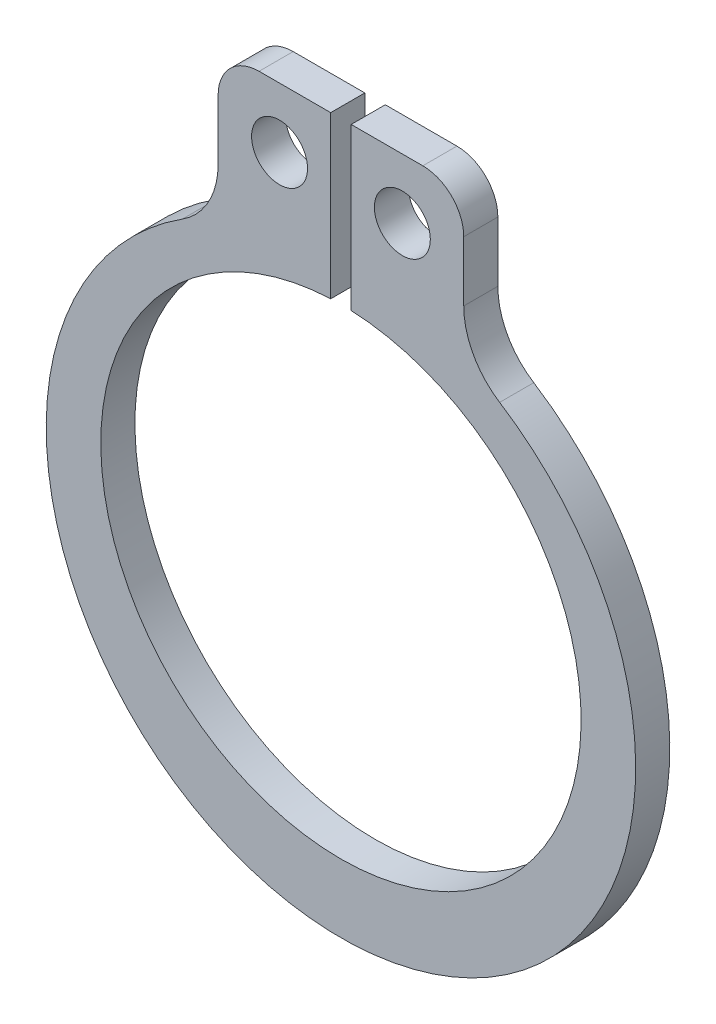
ISO-10303-21;
HEADER;
FILE_DESCRIPTION(('STEP AP214'),'2;1');
FILE_NAME('part.step','',(''),(''),'','','');
FILE_SCHEMA(('AUTOMOTIVE_DESIGN { 1 0 10303 214 1 1 1 1 }'));
ENDSEC;
DATA;
#1=APPLICATION_CONTEXT('core data for automotive mechanical design processes');
#2=APPLICATION_PROTOCOL_DEFINITION('international standard','automotive_design',2000,#1);
#3=PRODUCT_CONTEXT('',#1,'mechanical');
#4=PRODUCT('Part','Part','',(#3));
#5=PRODUCT_RELATED_PRODUCT_CATEGORY('part','',(#4));
#6=PRODUCT_DEFINITION_FORMATION('','',#4);
#7=PRODUCT_DEFINITION_CONTEXT('part definition',#1,'design');
#8=PRODUCT_DEFINITION('design','',#6,#7);
#9=PRODUCT_DEFINITION_SHAPE('','',#8);
#10=(LENGTH_UNIT() NAMED_UNIT(*) SI_UNIT(.MILLI.,.METRE.));
#11=(NAMED_UNIT(*) PLANE_ANGLE_UNIT() SI_UNIT($,.RADIAN.));
#12=(NAMED_UNIT(*) SI_UNIT($,.STERADIAN.) SOLID_ANGLE_UNIT());
#13=UNCERTAINTY_MEASURE_WITH_UNIT(LENGTH_MEASURE(1.E-05),#10,'distance_accuracy_value','');
#14=(GEOMETRIC_REPRESENTATION_CONTEXT(3) GLOBAL_UNCERTAINTY_ASSIGNED_CONTEXT((#13)) GLOBAL_UNIT_ASSIGNED_CONTEXT((#10,
#11,#12)) REPRESENTATION_CONTEXT('',''));
#15=CARTESIAN_POINT('',(0.,0.,0.));
#16=DIRECTION('',(0.,0.,1.));
#17=DIRECTION('',(1.,0.,0.));
#18=AXIS2_PLACEMENT_3D('',#15,#16,#17);
#19=CARTESIAN_POINT('',(0.,1.20019134133398,0.));
#20=DIRECTION('',(0.,0.,1.));
#21=DIRECTION('',(1.,0.,0.));
#22=AXIS2_PLACEMENT_3D('',#19,#20,#21);
#23=PLANE('',#22);
#24=CARTESIAN_POINT('',(-1.143,6.35,0.));
#25=DIRECTION('',(0.,0.,1.));
#26=DIRECTION('',(1.,0.,0.));
#27=AXIS2_PLACEMENT_3D('',#24,#25,#26);
#28=CIRCLE('',#27,0.5207);
#29=CARTESIAN_POINT('',(-0.6223,6.35,0.));
#30=VERTEX_POINT('',#29);
#31=EDGE_CURVE('E202',#30,#30,#28,.T.);
#32=ORIENTED_EDGE('',*,*,#31,.T.);
#33=EDGE_LOOP('',(#32));
#34=FACE_BOUND('',#33,.T.);
#35=CARTESIAN_POINT('',(1.143,6.35,0.));
#36=DIRECTION('',(0.,0.,1.));
#37=DIRECTION('',(1.,0.,0.));
#38=AXIS2_PLACEMENT_3D('',#35,#36,#37);
#39=CIRCLE('',#38,0.5207);
#40=CARTESIAN_POINT('',(1.6637,6.35,0.));
#41=VERTEX_POINT('',#40);
#42=EDGE_CURVE('E206',#41,#41,#39,.T.);
#43=ORIENTED_EDGE('',*,*,#42,.T.);
#44=EDGE_LOOP('',(#43));
#45=FACE_BOUND('',#44,.T.);
#46=DIRECTION('',(0.,1.,0.));
#47=VECTOR('',#46,1.);
#48=CARTESIAN_POINT('',(-0.1905,5.96696960338887,0.));
#49=LINE('',#48,#47);
#50=CARTESIAN_POINT('',(-0.1905,4.46633920677774,0.));
#51=VERTEX_POINT('',#50);
#52=CARTESIAN_POINT('',(-0.1905,7.4676,0.));
#53=VERTEX_POINT('',#52);
#54=EDGE_CURVE('E104',#51,#53,#49,.T.);
#55=ORIENTED_EDGE('',*,*,#54,.F.);
#56=CARTESIAN_POINT('',(0.,0.,0.));
#57=DIRECTION('',(0.,0.,1.));
#58=DIRECTION('',(1.,0.,0.));
#59=AXIS2_PLACEMENT_3D('',#56,#57,#58);
#60=CIRCLE('',#59,4.4704);
#61=CARTESIAN_POINT('',(0.1905,4.46633920677774,0.));
#62=VERTEX_POINT('',#61);
#63=EDGE_CURVE('E123',#51,#62,#60,.T.);
#64=ORIENTED_EDGE('',*,*,#63,.T.);
#65=DIRECTION('',(0.,1.,0.));
#66=VECTOR('',#65,1.);
#67=CARTESIAN_POINT('',(0.1905,5.96696960338887,0.));
#68=LINE('',#67,#66);
#69=CARTESIAN_POINT('',(0.1905,7.4676,0.));
#70=VERTEX_POINT('',#69);
#71=EDGE_CURVE('E121',#70,#62,#68,.F.);
#72=ORIENTED_EDGE('',*,*,#71,.F.);
#73=DIRECTION('',(1.,0.,0.));
#74=VECTOR('',#73,1.);
#75=CARTESIAN_POINT('',(0.1905,7.4676,0.));
#76=LINE('',#75,#74);
#77=CARTESIAN_POINT('',(1.524,7.4676,0.));
#78=VERTEX_POINT('',#77);
#79=EDGE_CURVE('E111',#78,#70,#76,.F.);
#80=ORIENTED_EDGE('',*,*,#79,.F.);
#81=CARTESIAN_POINT('',(1.524,6.7056,0.));
#82=DIRECTION('',(0.,0.,1.));
#83=DIRECTION('',(1.,0.,0.));
#84=AXIS2_PLACEMENT_3D('',#81,#82,#83);
#85=CIRCLE('',#84,0.762);
#86=CARTESIAN_POINT('',(2.286,6.7056,0.));
#87=VERTEX_POINT('',#86);
#88=EDGE_CURVE('E136',#87,#78,#85,.T.);
#89=ORIENTED_EDGE('',*,*,#88,.F.);
#90=DIRECTION('',(0.,1.,0.));
#91=VECTOR('',#90,1.);
#92=CARTESIAN_POINT('',(2.286,6.7056,0.));
#93=LINE('',#92,#91);
#94=CARTESIAN_POINT('',(2.286,5.58910424346512,0.));
#95=VERTEX_POINT('',#94);
#96=EDGE_CURVE('E140',#95,#87,#93,.T.);
#97=ORIENTED_EDGE('',*,*,#96,.F.);
#98=CARTESIAN_POINT('',(3.7338,5.58910424346512,0.));
#99=DIRECTION('',(0.,0.,1.));
#100=DIRECTION('',(1.,0.,0.));
#101=AXIS2_PLACEMENT_3D('',#98,#99,#100);
#102=CIRCLE('',#101,1.4478);
#103=CARTESIAN_POINT('',(2.95421538461538,4.369115445379,0.));
#104=VERTEX_POINT('',#103);
#105=EDGE_CURVE('E147',#95,#104,#102,.T.);
#106=ORIENTED_EDGE('',*,*,#105,.T.);
#107=CARTESIAN_POINT('',(0.,-0.254,0.));
#108=DIRECTION('',(0.,0.,1.));
#109=DIRECTION('',(1.,0.,0.));
#110=AXIS2_PLACEMENT_3D('',#107,#108,#109);
#111=CIRCLE('',#110,5.4864);
#112=CARTESIAN_POINT('',(-2.95421538461538,4.36911544537899,0.));
#113=VERTEX_POINT('',#112);
#114=EDGE_CURVE('E151',#113,#104,#111,.T.);
#115=ORIENTED_EDGE('',*,*,#114,.F.);
#116=CARTESIAN_POINT('',(-3.7338,5.58910424346512,0.));
#117=DIRECTION('',(0.,0.,1.));
#118=DIRECTION('',(1.,0.,0.));
#119=AXIS2_PLACEMENT_3D('',#116,#117,#118);
#120=CIRCLE('',#119,1.4478);
#121=CARTESIAN_POINT('',(-2.286,5.58910424346512,0.));
#122=VERTEX_POINT('',#121);
#123=EDGE_CURVE('E154',#113,#122,#120,.T.);
#124=ORIENTED_EDGE('',*,*,#123,.T.);
#125=DIRECTION('',(0.,1.,0.));
#126=VECTOR('',#125,1.);
#127=CARTESIAN_POINT('',(-2.286,5.58910424346512,0.));
#128=LINE('',#127,#126);
#129=CARTESIAN_POINT('',(-2.286,6.7056,0.));
#130=VERTEX_POINT('',#129);
#131=EDGE_CURVE('E158',#130,#122,#128,.F.);
#132=ORIENTED_EDGE('',*,*,#131,.F.);
#133=CARTESIAN_POINT('',(-1.524,6.7056,0.));
#134=DIRECTION('',(0.,0.,1.));
#135=DIRECTION('',(1.,0.,0.));
#136=AXIS2_PLACEMENT_3D('',#133,#134,#135);
#137=CIRCLE('',#136,0.762);
#138=CARTESIAN_POINT('',(-1.524,7.4676,0.));
#139=VERTEX_POINT('',#138);
#140=EDGE_CURVE('E19',#139,#130,#137,.T.);
#141=ORIENTED_EDGE('',*,*,#140,.F.);
#142=DIRECTION('',(1.,0.,0.));
#143=VECTOR('',#142,1.);
#144=CARTESIAN_POINT('',(-1.524,7.4676,0.));
#145=LINE('',#144,#143);
#146=EDGE_CURVE('E97',#53,#139,#145,.F.);
#147=ORIENTED_EDGE('',*,*,#146,.F.);
#148=EDGE_LOOP('',(#55,#64,#72,#80,#89,#97,#106,#115,#124,#132,#141,#147));
#149=FACE_BOUND('',#148,.T.);
#150=ADVANCED_FACE('F16',(#34,#45,#149),#23,.F.);
#151=CARTESIAN_POINT('',(-0.1905,5.96696960338887,0.));
#152=DIRECTION('',(1.,0.,0.));
#153=DIRECTION('',(0.,0.,-1.));
#154=AXIS2_PLACEMENT_3D('',#151,#152,#153);
#155=PLANE('',#154);
#156=ORIENTED_EDGE('',*,*,#54,.T.);
#157=DIRECTION('',(0.,0.,1.));
#158=VECTOR('',#157,1.);
#159=CARTESIAN_POINT('',(-0.1905,7.4676,0.));
#160=LINE('',#159,#158);
#161=CARTESIAN_POINT('',(-0.1905,7.4676,0.635));
#162=VERTEX_POINT('',#161);
#163=EDGE_CURVE('E162',#162,#53,#160,.F.);
#164=ORIENTED_EDGE('',*,*,#163,.F.);
#165=DIRECTION('',(0.,1.,0.));
#166=VECTOR('',#165,1.);
#167=CARTESIAN_POINT('',(-0.1905,1.20019134133398,0.635));
#168=LINE('',#167,#166);
#169=CARTESIAN_POINT('',(-0.1905,4.46633920677774,0.635));
#170=VERTEX_POINT('',#169);
#171=EDGE_CURVE('E205',#170,#162,#168,.T.);
#172=ORIENTED_EDGE('',*,*,#171,.F.);
#173=DIRECTION('',(0.,0.,1.));
#174=VECTOR('',#173,1.);
#175=CARTESIAN_POINT('',(-0.1905,4.46633920677774,0.));
#176=LINE('',#175,#174);
#177=EDGE_CURVE('E210',#170,#51,#176,.F.);
#178=ORIENTED_EDGE('',*,*,#177,.T.);
#179=EDGE_LOOP('',(#156,#164,#172,#178));
#180=FACE_BOUND('',#179,.T.);
#181=ADVANCED_FACE('F241',(#180),#155,.T.);
#182=CARTESIAN_POINT('',(-1.524,7.4676,0.));
#183=DIRECTION('',(0.,1.,0.));
#184=DIRECTION('',(0.,0.,1.));
#185=AXIS2_PLACEMENT_3D('',#182,#183,#184);
#186=PLANE('',#185);
#187=ORIENTED_EDGE('',*,*,#146,.T.);
#188=DIRECTION('',(0.,0.,1.));
#189=VECTOR('',#188,1.);
#190=CARTESIAN_POINT('',(-1.524,7.4676,0.));
#191=LINE('',#190,#189);
#192=CARTESIAN_POINT('',(-1.524,7.4676,0.635));
#193=VERTEX_POINT('',#192);
#194=EDGE_CURVE('E159',#193,#139,#191,.F.);
#195=ORIENTED_EDGE('',*,*,#194,.F.);
#196=DIRECTION('',(1.,0.,0.));
#197=VECTOR('',#196,1.);
#198=CARTESIAN_POINT('',(0.,7.4676,0.635));
#199=LINE('',#198,#197);
#200=EDGE_CURVE('E201',#162,#193,#199,.F.);
#201=ORIENTED_EDGE('',*,*,#200,.F.);
#202=ORIENTED_EDGE('',*,*,#163,.T.);
#203=EDGE_LOOP('',(#187,#195,#201,#202));
#204=FACE_BOUND('',#203,.T.);
#205=ADVANCED_FACE('F378',(#204),#186,.T.);
#206=CARTESIAN_POINT('',(-1.524,6.7056,0.));
#207=DIRECTION('',(0.,0.,1.));
#208=DIRECTION('',(1.,0.,0.));
#209=AXIS2_PLACEMENT_3D('',#206,#207,#208);
#210=CYLINDRICAL_SURFACE('',#209,0.762);
#211=ORIENTED_EDGE('',*,*,#140,.T.);
#212=DIRECTION('',(0.,0.,1.));
#213=VECTOR('',#212,1.);
#214=CARTESIAN_POINT('',(-2.286,6.7056,0.));
#215=LINE('',#214,#213);
#216=CARTESIAN_POINT('',(-2.286,6.7056,0.635));
#217=VERTEX_POINT('',#216);
#218=EDGE_CURVE('E155',#217,#130,#215,.F.);
#219=ORIENTED_EDGE('',*,*,#218,.F.);
#220=CARTESIAN_POINT('',(-1.524,6.7056,0.635));
#221=DIRECTION('',(0.,0.,1.));
#222=DIRECTION('',(1.,0.,0.));
#223=AXIS2_PLACEMENT_3D('',#220,#221,#222);
#224=CIRCLE('',#223,0.762);
#225=EDGE_CURVE('E198',#193,#217,#224,.T.);
#226=ORIENTED_EDGE('',*,*,#225,.F.);
#227=ORIENTED_EDGE('',*,*,#194,.T.);
#228=EDGE_LOOP('',(#211,#219,#226,#227));
#229=FACE_BOUND('',#228,.T.);
#230=ADVANCED_FACE('F370',(#229),#210,.T.);
#231=CARTESIAN_POINT('',(-2.286,5.58910424346512,0.));
#232=DIRECTION('',(-1.,0.,0.));
#233=DIRECTION('',(0.,0.,1.));
#234=AXIS2_PLACEMENT_3D('',#231,#232,#233);
#235=PLANE('',#234);
#236=ORIENTED_EDGE('',*,*,#131,.T.);
#237=DIRECTION('',(0.,0.,1.));
#238=VECTOR('',#237,1.);
#239=CARTESIAN_POINT('',(-2.286,5.58910424346512,0.));
#240=LINE('',#239,#238);
#241=CARTESIAN_POINT('',(-2.286,5.58910424346512,0.635));
#242=VERTEX_POINT('',#241);
#243=EDGE_CURVE('E152',#122,#242,#240,.T.);
#244=ORIENTED_EDGE('',*,*,#243,.T.);
#245=DIRECTION('',(0.,1.,0.));
#246=VECTOR('',#245,1.);
#247=CARTESIAN_POINT('',(-2.286,1.20019134133398,0.635));
#248=LINE('',#247,#246);
#249=EDGE_CURVE('E197',#217,#242,#248,.F.);
#250=ORIENTED_EDGE('',*,*,#249,.F.);
#251=ORIENTED_EDGE('',*,*,#218,.T.);
#252=EDGE_LOOP('',(#236,#244,#250,#251));
#253=FACE_BOUND('',#252,.T.);
#254=ADVANCED_FACE('F219',(#253),#235,.T.);
#255=CARTESIAN_POINT('',(-3.7338,5.58910424346512,0.));
#256=DIRECTION('',(0.,0.,1.));
#257=DIRECTION('',(1.,0.,0.));
#258=AXIS2_PLACEMENT_3D('',#255,#256,#257);
#259=CYLINDRICAL_SURFACE('',#258,1.4478);
#260=ORIENTED_EDGE('',*,*,#243,.F.);
#261=ORIENTED_EDGE('',*,*,#123,.F.);
#262=DIRECTION('',(0.,0.,1.));
#263=VECTOR('',#262,1.);
#264=CARTESIAN_POINT('',(-2.95421538461538,4.36911544537899,0.));
#265=LINE('',#264,#263);
#266=CARTESIAN_POINT('',(-2.95421538461538,4.36911544537899,0.635));
#267=VERTEX_POINT('',#266);
#268=EDGE_CURVE('E148',#267,#113,#265,.F.);
#269=ORIENTED_EDGE('',*,*,#268,.F.);
#270=CARTESIAN_POINT('',(-3.7338,5.58910424346512,0.635));
#271=DIRECTION('',(0.,0.,1.));
#272=DIRECTION('',(1.,0.,0.));
#273=AXIS2_PLACEMENT_3D('',#270,#271,#272);
#274=CIRCLE('',#273,1.4478);
#275=EDGE_CURVE('E194',#242,#267,#274,.F.);
#276=ORIENTED_EDGE('',*,*,#275,.F.);
#277=EDGE_LOOP('',(#260,#261,#269,#276));
#278=FACE_BOUND('',#277,.T.);
#279=ADVANCED_FACE('F222',(#278),#259,.F.);
#280=CARTESIAN_POINT('',(0.,-0.254,0.));
#281=DIRECTION('',(0.,0.,1.));
#282=DIRECTION('',(1.,0.,0.));
#283=AXIS2_PLACEMENT_3D('',#280,#281,#282);
#284=CYLINDRICAL_SURFACE('',#283,5.4864);
#285=DIRECTION('',(0.,0.,1.));
#286=VECTOR('',#285,1.);
#287=CARTESIAN_POINT('',(2.95421538461538,4.369115445379,0.));
#288=LINE('',#287,#286);
#289=CARTESIAN_POINT('',(2.95421538461538,4.369115445379,0.635));
#290=VERTEX_POINT('',#289);
#291=EDGE_CURVE('E144',#104,#290,#288,.T.);
#292=ORIENTED_EDGE('',*,*,#291,.T.);
#293=CARTESIAN_POINT('',(0.,-0.254,0.635));
#294=DIRECTION('',(0.,0.,1.));
#295=DIRECTION('',(1.,0.,0.));
#296=AXIS2_PLACEMENT_3D('',#293,#294,#295);
#297=CIRCLE('',#296,5.4864);
#298=EDGE_CURVE('E192',#267,#290,#297,.T.);
#299=ORIENTED_EDGE('',*,*,#298,.F.);
#300=ORIENTED_EDGE('',*,*,#268,.T.);
#301=ORIENTED_EDGE('',*,*,#114,.T.);
#302=EDGE_LOOP('',(#292,#299,#300,#301));
#303=FACE_BOUND('',#302,.T.);
#304=ADVANCED_FACE('F262',(#303),#284,.T.);
#305=CARTESIAN_POINT('',(3.7338,5.58910424346512,0.));
#306=DIRECTION('',(0.,0.,1.));
#307=DIRECTION('',(1.,0.,0.));
#308=AXIS2_PLACEMENT_3D('',#305,#306,#307);
#309=CYLINDRICAL_SURFACE('',#308,1.4478);
#310=ORIENTED_EDGE('',*,*,#291,.F.);
#311=ORIENTED_EDGE('',*,*,#105,.F.);
#312=DIRECTION('',(0.,0.,-1.));
#313=VECTOR('',#312,1.);
#314=CARTESIAN_POINT('',(2.286,5.58910424346512,0.));
#315=LINE('',#314,#313);
#316=CARTESIAN_POINT('',(2.286,5.58910424346512,0.635));
#317=VERTEX_POINT('',#316);
#318=EDGE_CURVE('E141',#317,#95,#315,.T.);
#319=ORIENTED_EDGE('',*,*,#318,.F.);
#320=CARTESIAN_POINT('',(3.7338,5.58910424346512,0.635));
#321=DIRECTION('',(0.,0.,1.));
#322=DIRECTION('',(1.,0.,0.));
#323=AXIS2_PLACEMENT_3D('',#320,#321,#322);
#324=CIRCLE('',#323,1.4478);
#325=EDGE_CURVE('E189',#290,#317,#324,.F.);
#326=ORIENTED_EDGE('',*,*,#325,.F.);
#327=EDGE_LOOP('',(#310,#311,#319,#326));
#328=FACE_BOUND('',#327,.T.);
#329=ADVANCED_FACE('F260',(#328),#309,.F.);
#330=CARTESIAN_POINT('',(2.286,6.7056,0.));
#331=DIRECTION('',(1.,0.,0.));
#332=DIRECTION('',(0.,0.,-1.));
#333=AXIS2_PLACEMENT_3D('',#330,#331,#332);
#334=PLANE('',#333);
#335=ORIENTED_EDGE('',*,*,#96,.T.);
#336=DIRECTION('',(0.,0.,1.));
#337=VECTOR('',#336,1.);
#338=CARTESIAN_POINT('',(2.286,6.7056,0.));
#339=LINE('',#338,#337);
#340=CARTESIAN_POINT('',(2.286,6.7056,0.635));
#341=VERTEX_POINT('',#340);
#342=EDGE_CURVE('E137',#341,#87,#339,.F.);
#343=ORIENTED_EDGE('',*,*,#342,.F.);
#344=DIRECTION('',(0.,1.,0.));
#345=VECTOR('',#344,1.);
#346=CARTESIAN_POINT('',(2.286,1.20019134133398,0.635));
#347=LINE('',#346,#345);
#348=EDGE_CURVE('E188',#317,#341,#347,.T.);
#349=ORIENTED_EDGE('',*,*,#348,.F.);
#350=ORIENTED_EDGE('',*,*,#318,.T.);
#351=EDGE_LOOP('',(#335,#343,#349,#350));
#352=FACE_BOUND('',#351,.T.);
#353=ADVANCED_FACE('F256',(#352),#334,.T.);
#354=CARTESIAN_POINT('',(1.524,6.7056,0.));
#355=DIRECTION('',(0.,0.,1.));
#356=DIRECTION('',(1.,0.,0.));
#357=AXIS2_PLACEMENT_3D('',#354,#355,#356);
#358=CYLINDRICAL_SURFACE('',#357,0.762);
#359=ORIENTED_EDGE('',*,*,#88,.T.);
#360=DIRECTION('',(0.,0.,1.));
#361=VECTOR('',#360,1.);
#362=CARTESIAN_POINT('',(1.524,7.4676,0.));
#363=LINE('',#362,#361);
#364=CARTESIAN_POINT('',(1.524,7.4676,0.635));
#365=VERTEX_POINT('',#364);
#366=EDGE_CURVE('E117',#365,#78,#363,.F.);
#367=ORIENTED_EDGE('',*,*,#366,.F.);
#368=CARTESIAN_POINT('',(1.524,6.7056,0.635));
#369=DIRECTION('',(0.,0.,1.));
#370=DIRECTION('',(1.,0.,0.));
#371=AXIS2_PLACEMENT_3D('',#368,#369,#370);
#372=CIRCLE('',#371,0.762);
#373=EDGE_CURVE('E184',#341,#365,#372,.T.);
#374=ORIENTED_EDGE('',*,*,#373,.F.);
#375=ORIENTED_EDGE('',*,*,#342,.T.);
#376=EDGE_LOOP('',(#359,#367,#374,#375));
#377=FACE_BOUND('',#376,.T.);
#378=ADVANCED_FACE('F253',(#377),#358,.T.);
#379=CARTESIAN_POINT('',(0.1905,7.4676,0.));
#380=DIRECTION('',(0.,1.,0.));
#381=DIRECTION('',(0.,0.,1.));
#382=AXIS2_PLACEMENT_3D('',#379,#380,#381);
#383=PLANE('',#382);
#384=ORIENTED_EDGE('',*,*,#79,.T.);
#385=DIRECTION('',(0.,0.,1.));
#386=VECTOR('',#385,1.);
#387=CARTESIAN_POINT('',(0.1905,7.4676,0.));
#388=LINE('',#387,#386);
#389=CARTESIAN_POINT('',(0.1905,7.4676,0.635));
#390=VERTEX_POINT('',#389);
#391=EDGE_CURVE('E116',#390,#70,#388,.F.);
#392=ORIENTED_EDGE('',*,*,#391,.F.);
#393=DIRECTION('',(1.,0.,0.));
#394=VECTOR('',#393,1.);
#395=CARTESIAN_POINT('',(0.,7.4676,0.635));
#396=LINE('',#395,#394);
#397=EDGE_CURVE('E187',#365,#390,#396,.F.);
#398=ORIENTED_EDGE('',*,*,#397,.F.);
#399=ORIENTED_EDGE('',*,*,#366,.T.);
#400=EDGE_LOOP('',(#384,#392,#398,#399));
#401=FACE_BOUND('',#400,.T.);
#402=ADVANCED_FACE('F113',(#401),#383,.T.);
#403=CARTESIAN_POINT('',(0.1905,5.96696960338887,0.));
#404=DIRECTION('',(-1.,0.,0.));
#405=DIRECTION('',(0.,0.,1.));
#406=AXIS2_PLACEMENT_3D('',#403,#404,#405);
#407=PLANE('',#406);
#408=ORIENTED_EDGE('',*,*,#71,.T.);
#409=DIRECTION('',(0.,0.,1.));
#410=VECTOR('',#409,1.);
#411=CARTESIAN_POINT('',(0.1905,4.46633920677774,0.));
#412=LINE('',#411,#410);
#413=CARTESIAN_POINT('',(0.1905,4.46633920677774,0.635));
#414=VERTEX_POINT('',#413);
#415=EDGE_CURVE('E34',#62,#414,#412,.T.);
#416=ORIENTED_EDGE('',*,*,#415,.T.);
#417=DIRECTION('',(0.,1.,0.));
#418=VECTOR('',#417,1.);
#419=CARTESIAN_POINT('',(0.1905,1.20019134133398,0.635));
#420=LINE('',#419,#418);
#421=EDGE_CURVE('E127',#390,#414,#420,.F.);
#422=ORIENTED_EDGE('',*,*,#421,.F.);
#423=ORIENTED_EDGE('',*,*,#391,.T.);
#424=EDGE_LOOP('',(#408,#416,#422,#423));
#425=FACE_BOUND('',#424,.T.);
#426=ADVANCED_FACE('F125',(#425),#407,.T.);
#427=CARTESIAN_POINT('',(0.,0.,0.));
#428=DIRECTION('',(0.,0.,1.));
#429=DIRECTION('',(1.,0.,0.));
#430=AXIS2_PLACEMENT_3D('',#427,#428,#429);
#431=CYLINDRICAL_SURFACE('',#430,4.4704);
#432=ORIENTED_EDGE('',*,*,#63,.F.);
#433=ORIENTED_EDGE('',*,*,#177,.F.);
#434=CARTESIAN_POINT('',(0.,0.,0.635));
#435=DIRECTION('',(0.,0.,1.));
#436=DIRECTION('',(1.,0.,0.));
#437=AXIS2_PLACEMENT_3D('',#434,#435,#436);
#438=CIRCLE('',#437,4.4704);
#439=EDGE_CURVE('E181',#414,#170,#438,.F.);
#440=ORIENTED_EDGE('',*,*,#439,.F.);
#441=ORIENTED_EDGE('',*,*,#415,.F.);
#442=EDGE_LOOP('',(#432,#433,#440,#441));
#443=FACE_BOUND('',#442,.T.);
#444=ADVANCED_FACE('F243',(#443),#431,.F.);
#445=CARTESIAN_POINT('',(1.143,6.35,0.));
#446=DIRECTION('',(0.,0.,1.));
#447=DIRECTION('',(1.,0.,0.));
#448=AXIS2_PLACEMENT_3D('',#445,#446,#447);
#449=CYLINDRICAL_SURFACE('',#448,0.5207);
#450=ORIENTED_EDGE('',*,*,#42,.F.);
#451=EDGE_LOOP('',(#450));
#452=FACE_BOUND('',#451,.T.);
#453=CARTESIAN_POINT('',(1.143,6.35,0.635));
#454=DIRECTION('',(0.,0.,1.));
#455=DIRECTION('',(1.,0.,0.));
#456=AXIS2_PLACEMENT_3D('',#453,#454,#455);
#457=CIRCLE('',#456,0.5207);
#458=CARTESIAN_POINT('',(1.6637,6.35,0.635));
#459=VERTEX_POINT('',#458);
#460=EDGE_CURVE('E25',#459,#459,#457,.F.);
#461=ORIENTED_EDGE('',*,*,#460,.F.);
#462=EDGE_LOOP('',(#461));
#463=FACE_BOUND('',#462,.T.);
#464=ADVANCED_FACE('F279',(#452,#463),#449,.F.);
#465=CARTESIAN_POINT('',(-1.143,6.35,0.));
#466=DIRECTION('',(0.,0.,1.));
#467=DIRECTION('',(1.,0.,0.));
#468=AXIS2_PLACEMENT_3D('',#465,#466,#467);
#469=CYLINDRICAL_SURFACE('',#468,0.5207);
#470=ORIENTED_EDGE('',*,*,#31,.F.);
#471=EDGE_LOOP('',(#470));
#472=FACE_BOUND('',#471,.T.);
#473=CARTESIAN_POINT('',(-1.143,6.35,0.635));
#474=DIRECTION('',(0.,0.,1.));
#475=DIRECTION('',(1.,0.,0.));
#476=AXIS2_PLACEMENT_3D('',#473,#474,#475);
#477=CIRCLE('',#476,0.5207);
#478=CARTESIAN_POINT('',(-0.6223,6.35,0.635));
#479=VERTEX_POINT('',#478);
#480=EDGE_CURVE('E11',#479,#479,#477,.F.);
#481=ORIENTED_EDGE('',*,*,#480,.F.);
#482=EDGE_LOOP('',(#481));
#483=FACE_BOUND('',#482,.T.);
#484=ADVANCED_FACE('F273',(#472,#483),#469,.F.);
#485=CARTESIAN_POINT('',(0.,1.20019134133398,0.635));
#486=DIRECTION('',(0.,0.,1.));
#487=DIRECTION('',(1.,0.,0.));
#488=AXIS2_PLACEMENT_3D('',#485,#486,#487);
#489=PLANE('',#488);
#490=ORIENTED_EDGE('',*,*,#480,.T.);
#491=EDGE_LOOP('',(#490));
#492=FACE_BOUND('',#491,.T.);
#493=ORIENTED_EDGE('',*,*,#460,.T.);
#494=EDGE_LOOP('',(#493));
#495=FACE_BOUND('',#494,.T.);
#496=ORIENTED_EDGE('',*,*,#439,.T.);
#497=ORIENTED_EDGE('',*,*,#171,.T.);
#498=ORIENTED_EDGE('',*,*,#200,.T.);
#499=ORIENTED_EDGE('',*,*,#225,.T.);
#500=ORIENTED_EDGE('',*,*,#249,.T.);
#501=ORIENTED_EDGE('',*,*,#275,.T.);
#502=ORIENTED_EDGE('',*,*,#298,.T.);
#503=ORIENTED_EDGE('',*,*,#325,.T.);
#504=ORIENTED_EDGE('',*,*,#348,.T.);
#505=ORIENTED_EDGE('',*,*,#373,.T.);
#506=ORIENTED_EDGE('',*,*,#397,.T.);
#507=ORIENTED_EDGE('',*,*,#421,.T.);
#508=EDGE_LOOP('',(#496,#497,#498,#499,#500,#501,#502,#503,#504,#505,#506,#507));
#509=FACE_BOUND('',#508,.T.);
#510=ADVANCED_FACE('F226',(#492,#495,#509),#489,.T.);
#511=CLOSED_SHELL('',(#150,#181,#205,#230,#254,#279,#304,#329,#353,#378,#402,#426,#444,#464,
#484,#510));
#512=MANIFOLD_SOLID_BREP('B1',#511);
#513=ADVANCED_BREP_SHAPE_REPRESENTATION('',(#18,#512),#14);
#514=SHAPE_DEFINITION_REPRESENTATION(#9,#513);
ENDSEC;
END-ISO-10303-21;
